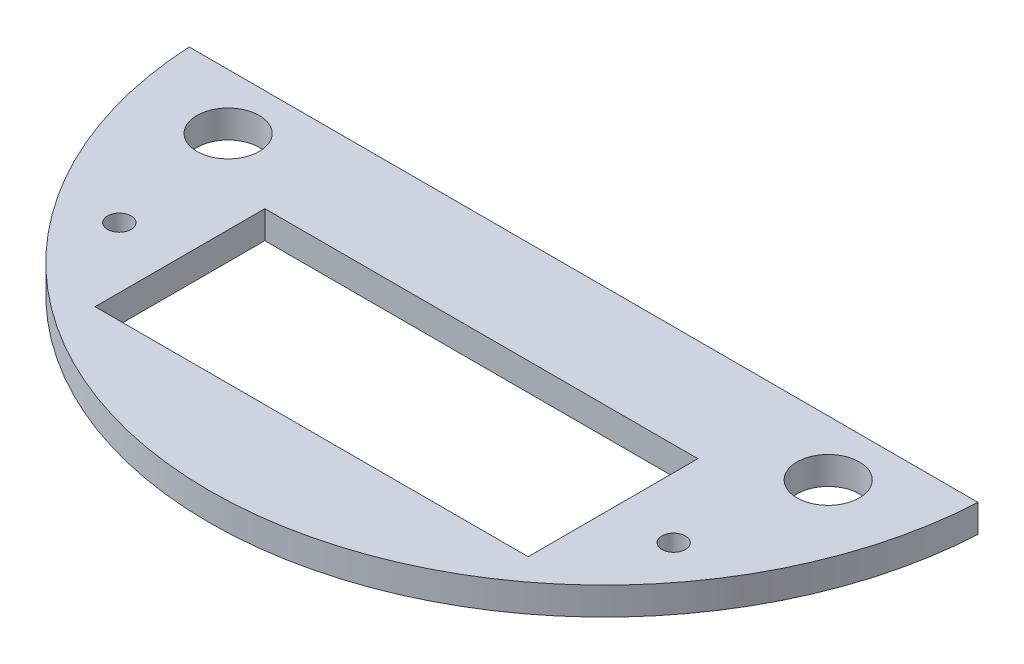
ISO-10303-21;
HEADER;
FILE_DESCRIPTION(('STEP AP214'),'2;1');
FILE_NAME('part.step','',(''),(''),'','','');
FILE_SCHEMA(('AUTOMOTIVE_DESIGN { 1 0 10303 214 1 1 1 1 }'));
ENDSEC;
DATA;
#1=APPLICATION_CONTEXT('core data for automotive mechanical design processes');
#2=APPLICATION_PROTOCOL_DEFINITION('international standard','automotive_design',2000,#1);
#3=PRODUCT_CONTEXT('',#1,'mechanical');
#4=PRODUCT('Part','Part','',(#3));
#5=PRODUCT_RELATED_PRODUCT_CATEGORY('part','',(#4));
#6=PRODUCT_DEFINITION_FORMATION('','',#4);
#7=PRODUCT_DEFINITION_CONTEXT('part definition',#1,'design');
#8=PRODUCT_DEFINITION('design','',#6,#7);
#9=PRODUCT_DEFINITION_SHAPE('','',#8);
#10=(LENGTH_UNIT() NAMED_UNIT(*) SI_UNIT(.MILLI.,.METRE.));
#11=(NAMED_UNIT(*) PLANE_ANGLE_UNIT() SI_UNIT($,.RADIAN.));
#12=(NAMED_UNIT(*) SI_UNIT($,.STERADIAN.) SOLID_ANGLE_UNIT());
#13=UNCERTAINTY_MEASURE_WITH_UNIT(LENGTH_MEASURE(1.E-05),#10,'distance_accuracy_value','');
#14=(GEOMETRIC_REPRESENTATION_CONTEXT(3) GLOBAL_UNCERTAINTY_ASSIGNED_CONTEXT((#13)) GLOBAL_UNIT_ASSIGNED_CONTEXT((#10,
#11,#12)) REPRESENTATION_CONTEXT('',''));
#15=CARTESIAN_POINT('',(0.,0.,0.));
#16=DIRECTION('',(0.,0.,1.));
#17=DIRECTION('',(1.,0.,0.));
#18=AXIS2_PLACEMENT_3D('',#15,#16,#17);
#19=CARTESIAN_POINT('',(0.,4.,0.));
#20=DIRECTION('',(0.,1.,0.));
#21=DIRECTION('',(0.,0.,1.));
#22=AXIS2_PLACEMENT_3D('',#19,#20,#21);
#23=PLANE('',#22);
#24=CARTESIAN_POINT('',(40.,4.,0.));
#25=DIRECTION('',(0.,-1.,0.));
#26=DIRECTION('',(0.,0.,-1.));
#27=AXIS2_PLACEMENT_3D('',#24,#25,#26);
#28=CIRCLE('',#27,1.7);
#29=CARTESIAN_POINT('',(40.,4.,-1.7));
#30=VERTEX_POINT('',#29);
#31=EDGE_CURVE('E146',#30,#30,#28,.T.);
#32=ORIENTED_EDGE('',*,*,#31,.T.);
#33=EDGE_LOOP('',(#32));
#34=FACE_BOUND('',#33,.T.);
#35=CARTESIAN_POINT('',(-40.,4.,0.));
#36=DIRECTION('',(0.,-1.,0.));
#37=DIRECTION('',(0.,0.,-1.));
#38=AXIS2_PLACEMENT_3D('',#35,#36,#37);
#39=CIRCLE('',#38,1.7);
#40=CARTESIAN_POINT('',(-40.,4.,-1.7));
#41=VERTEX_POINT('',#40);
#42=EDGE_CURVE('E93',#41,#41,#39,.T.);
#43=ORIENTED_EDGE('',*,*,#42,.T.);
#44=EDGE_LOOP('',(#43));
#45=FACE_BOUND('',#44,.T.);
#46=CARTESIAN_POINT('',(-43.3,4.,-19.));
#47=DIRECTION('',(0.,1.,0.));
#48=DIRECTION('',(0.,0.,1.));
#49=AXIS2_PLACEMENT_3D('',#46,#47,#48);
#50=CIRCLE('',#49,4.49999999999999);
#51=CARTESIAN_POINT('',(-43.3,4.,-14.5));
#52=VERTEX_POINT('',#51);
#53=EDGE_CURVE('E137',#52,#52,#50,.T.);
#54=ORIENTED_EDGE('',*,*,#53,.F.);
#55=EDGE_LOOP('',(#54));
#56=FACE_BOUND('',#55,.T.);
#57=CARTESIAN_POINT('',(43.3,4.,-19.));
#58=DIRECTION('',(0.,1.,0.));
#59=DIRECTION('',(0.,0.,1.));
#60=AXIS2_PLACEMENT_3D('',#57,#58,#59);
#61=CIRCLE('',#60,4.49999999999999);
#62=CARTESIAN_POINT('',(43.3,4.,-14.5));
#63=VERTEX_POINT('',#62);
#64=EDGE_CURVE('E131',#63,#63,#61,.T.);
#65=ORIENTED_EDGE('',*,*,#64,.F.);
#66=EDGE_LOOP('',(#65));
#67=FACE_BOUND('',#66,.T.);
#68=DIRECTION('',(1.,0.,0.));
#69=VECTOR('',#68,1.);
#70=CARTESIAN_POINT('',(31.25,4.,12.25));
#71=LINE('',#70,#69);
#72=CARTESIAN_POINT('',(-31.25,4.,12.25));
#73=VERTEX_POINT('',#72);
#74=CARTESIAN_POINT('',(31.25,4.,12.25));
#75=VERTEX_POINT('',#74);
#76=EDGE_CURVE('E126',#73,#75,#71,.T.);
#77=ORIENTED_EDGE('',*,*,#76,.F.);
#78=DIRECTION('',(0.,0.,1.));
#79=VECTOR('',#78,1.);
#80=CARTESIAN_POINT('',(-31.25,4.,-12.25));
#81=LINE('',#80,#79);
#82=CARTESIAN_POINT('',(-31.25,4.,-12.25));
#83=VERTEX_POINT('',#82);
#84=EDGE_CURVE('E112',#83,#73,#81,.T.);
#85=ORIENTED_EDGE('',*,*,#84,.F.);
#86=DIRECTION('',(-1.,0.,0.));
#87=VECTOR('',#86,1.);
#88=CARTESIAN_POINT('',(31.25,4.,-12.25));
#89=LINE('',#88,#87);
#90=CARTESIAN_POINT('',(31.25,4.,-12.25));
#91=VERTEX_POINT('',#90);
#92=EDGE_CURVE('E108',#91,#83,#89,.T.);
#93=ORIENTED_EDGE('',*,*,#92,.F.);
#94=DIRECTION('',(0.,0.,-1.));
#95=VECTOR('',#94,1.);
#96=CARTESIAN_POINT('',(31.25,4.,-12.25));
#97=LINE('',#96,#95);
#98=EDGE_CURVE('E124',#75,#91,#97,.T.);
#99=ORIENTED_EDGE('',*,*,#98,.F.);
#100=EDGE_LOOP('',(#77,#85,#93,#99));
#101=FACE_BOUND('',#100,.T.);
#102=DIRECTION('',(-1.,0.,0.));
#103=VECTOR('',#102,1.);
#104=CARTESIAN_POINT('',(-58.9016078409477,4.,-27.));
#105=LINE('',#104,#103);
#106=CARTESIAN_POINT('',(56.9209978830308,4.,-27.));
#107=VERTEX_POINT('',#106);
#108=CARTESIAN_POINT('',(-56.9209978830308,4.,-27.));
#109=VERTEX_POINT('',#108);
#110=EDGE_CURVE('E92',#107,#109,#105,.T.);
#111=ORIENTED_EDGE('',*,*,#110,.T.);
#112=CARTESIAN_POINT('',(0.,4.,-30.));
#113=DIRECTION('',(0.,1.,0.));
#114=DIRECTION('',(0.,0.,1.));
#115=AXIS2_PLACEMENT_3D('',#112,#113,#114);
#116=CIRCLE('',#115,57.);
#117=EDGE_CURVE('E47',#109,#107,#116,.T.);
#118=ORIENTED_EDGE('',*,*,#117,.T.);
#119=EDGE_LOOP('',(#111,#118));
#120=FACE_BOUND('',#119,.T.);
#121=ADVANCED_FACE('F33',(#34,#45,#56,#67,#101,#120),#23,.T.);
#122=CARTESIAN_POINT('',(0.,0.,0.));
#123=DIRECTION('',(0.,1.,0.));
#124=DIRECTION('',(0.,0.,1.));
#125=AXIS2_PLACEMENT_3D('',#122,#123,#124);
#126=PLANE('',#125);
#127=CARTESIAN_POINT('',(40.,0.,0.));
#128=DIRECTION('',(0.,-1.,0.));
#129=DIRECTION('',(0.,0.,-1.));
#130=AXIS2_PLACEMENT_3D('',#127,#128,#129);
#131=CIRCLE('',#130,1.7);
#132=CARTESIAN_POINT('',(40.,0.,-1.7));
#133=VERTEX_POINT('',#132);
#134=EDGE_CURVE('E149',#133,#133,#131,.T.);
#135=ORIENTED_EDGE('',*,*,#134,.F.);
#136=EDGE_LOOP('',(#135));
#137=FACE_BOUND('',#136,.T.);
#138=CARTESIAN_POINT('',(-40.,0.,0.));
#139=DIRECTION('',(0.,-1.,0.));
#140=DIRECTION('',(0.,0.,-1.));
#141=AXIS2_PLACEMENT_3D('',#138,#139,#140);
#142=CIRCLE('',#141,1.7);
#143=CARTESIAN_POINT('',(-40.,0.,-1.7));
#144=VERTEX_POINT('',#143);
#145=EDGE_CURVE('E143',#144,#144,#142,.T.);
#146=ORIENTED_EDGE('',*,*,#145,.F.);
#147=EDGE_LOOP('',(#146));
#148=FACE_BOUND('',#147,.T.);
#149=DIRECTION('',(0.,0.,1.));
#150=VECTOR('',#149,1.);
#151=CARTESIAN_POINT('',(-31.25,0.,-12.25));
#152=LINE('',#151,#150);
#153=CARTESIAN_POINT('',(-31.25,0.,-12.25));
#154=VERTEX_POINT('',#153);
#155=CARTESIAN_POINT('',(-31.25,0.,12.25));
#156=VERTEX_POINT('',#155);
#157=EDGE_CURVE('E119',#154,#156,#152,.T.);
#158=ORIENTED_EDGE('',*,*,#157,.T.);
#159=DIRECTION('',(1.,0.,0.));
#160=VECTOR('',#159,1.);
#161=CARTESIAN_POINT('',(31.25,0.,12.25));
#162=LINE('',#161,#160);
#163=CARTESIAN_POINT('',(31.25,0.,12.25));
#164=VERTEX_POINT('',#163);
#165=EDGE_CURVE('E116',#156,#164,#162,.T.);
#166=ORIENTED_EDGE('',*,*,#165,.T.);
#167=DIRECTION('',(0.,0.,-1.));
#168=VECTOR('',#167,1.);
#169=CARTESIAN_POINT('',(31.25,0.,-12.25));
#170=LINE('',#169,#168);
#171=CARTESIAN_POINT('',(31.25,0.,-12.25));
#172=VERTEX_POINT('',#171);
#173=EDGE_CURVE('E113',#164,#172,#170,.T.);
#174=ORIENTED_EDGE('',*,*,#173,.T.);
#175=DIRECTION('',(-1.,0.,0.));
#176=VECTOR('',#175,1.);
#177=CARTESIAN_POINT('',(31.25,0.,-12.25));
#178=LINE('',#177,#176);
#179=EDGE_CURVE('E109',#172,#154,#178,.T.);
#180=ORIENTED_EDGE('',*,*,#179,.T.);
#181=EDGE_LOOP('',(#158,#166,#174,#180));
#182=FACE_BOUND('',#181,.T.);
#183=CARTESIAN_POINT('',(43.3,0.,-19.));
#184=DIRECTION('',(0.,1.,0.));
#185=DIRECTION('',(0.,0.,1.));
#186=AXIS2_PLACEMENT_3D('',#183,#184,#185);
#187=CIRCLE('',#186,4.5);
#188=CARTESIAN_POINT('',(43.3,0.,-14.5));
#189=VERTEX_POINT('',#188);
#190=EDGE_CURVE('E122',#189,#189,#187,.T.);
#191=ORIENTED_EDGE('',*,*,#190,.T.);
#192=EDGE_LOOP('',(#191));
#193=FACE_BOUND('',#192,.T.);
#194=CARTESIAN_POINT('',(-43.3,0.,-19.));
#195=DIRECTION('',(0.,1.,0.));
#196=DIRECTION('',(0.,0.,1.));
#197=AXIS2_PLACEMENT_3D('',#194,#195,#196);
#198=CIRCLE('',#197,4.5);
#199=CARTESIAN_POINT('',(-43.3,0.,-14.5));
#200=VERTEX_POINT('',#199);
#201=EDGE_CURVE('E134',#200,#200,#198,.T.);
#202=ORIENTED_EDGE('',*,*,#201,.T.);
#203=EDGE_LOOP('',(#202));
#204=FACE_BOUND('',#203,.T.);
#205=CARTESIAN_POINT('',(0.,0.,-30.));
#206=DIRECTION('',(0.,1.,0.));
#207=DIRECTION('',(0.,0.,1.));
#208=AXIS2_PLACEMENT_3D('',#205,#206,#207);
#209=CIRCLE('',#208,57.);
#210=CARTESIAN_POINT('',(-56.9209978830308,0.,-27.));
#211=VERTEX_POINT('',#210);
#212=CARTESIAN_POINT('',(56.9209978830308,0.,-27.));
#213=VERTEX_POINT('',#212);
#214=EDGE_CURVE('E85',#211,#213,#209,.T.);
#215=ORIENTED_EDGE('',*,*,#214,.F.);
#216=DIRECTION('',(-1.,0.,0.));
#217=VECTOR('',#216,1.);
#218=CARTESIAN_POINT('',(-58.9016078409477,0.,-27.));
#219=LINE('',#218,#217);
#220=EDGE_CURVE('E95',#213,#211,#219,.T.);
#221=ORIENTED_EDGE('',*,*,#220,.F.);
#222=EDGE_LOOP('',(#215,#221));
#223=FACE_BOUND('',#222,.T.);
#224=ADVANCED_FACE('F155',(#137,#148,#182,#193,#204,#223),#126,.F.);
#225=CARTESIAN_POINT('',(-58.9016078409477,4.,-27.));
#226=DIRECTION('',(0.,0.,1.));
#227=DIRECTION('',(1.,0.,0.));
#228=AXIS2_PLACEMENT_3D('',#225,#226,#227);
#229=PLANE('',#228);
#230=DIRECTION('',(0.,1.,0.));
#231=VECTOR('',#230,1.);
#232=CARTESIAN_POINT('',(56.9209978830308,0.,-27.));
#233=LINE('',#232,#231);
#234=EDGE_CURVE('E11',#213,#107,#233,.T.);
#235=ORIENTED_EDGE('',*,*,#234,.F.);
#236=ORIENTED_EDGE('',*,*,#220,.T.);
#237=DIRECTION('',(0.,1.,0.));
#238=VECTOR('',#237,1.);
#239=CARTESIAN_POINT('',(-56.9209978830308,0.,-27.));
#240=LINE('',#239,#238);
#241=EDGE_CURVE('E41',#109,#211,#240,.F.);
#242=ORIENTED_EDGE('',*,*,#241,.F.);
#243=ORIENTED_EDGE('',*,*,#110,.F.);
#244=EDGE_LOOP('',(#235,#236,#242,#243));
#245=FACE_BOUND('',#244,.T.);
#246=ADVANCED_FACE('F35',(#245),#229,.F.);
#247=CARTESIAN_POINT('',(-31.25,4.,-12.25));
#248=DIRECTION('',(1.,0.,0.));
#249=DIRECTION('',(0.,0.,-1.));
#250=AXIS2_PLACEMENT_3D('',#247,#248,#249);
#251=PLANE('',#250);
#252=ORIENTED_EDGE('',*,*,#157,.F.);
#253=DIRECTION('',(0.,-1.,0.));
#254=VECTOR('',#253,1.);
#255=CARTESIAN_POINT('',(-31.25,4.,-12.25));
#256=LINE('',#255,#254);
#257=EDGE_CURVE('E105',#83,#154,#256,.T.);
#258=ORIENTED_EDGE('',*,*,#257,.F.);
#259=ORIENTED_EDGE('',*,*,#84,.T.);
#260=DIRECTION('',(0.,-1.,0.));
#261=VECTOR('',#260,1.);
#262=CARTESIAN_POINT('',(-31.25,4.,12.25));
#263=LINE('',#262,#261);
#264=EDGE_CURVE('E97',#73,#156,#263,.T.);
#265=ORIENTED_EDGE('',*,*,#264,.T.);
#266=EDGE_LOOP('',(#252,#258,#259,#265));
#267=FACE_BOUND('',#266,.T.);
#268=ADVANCED_FACE('F191',(#267),#251,.T.);
#269=CARTESIAN_POINT('',(31.25,4.,12.25));
#270=DIRECTION('',(0.,0.,-1.));
#271=DIRECTION('',(-1.,0.,0.));
#272=AXIS2_PLACEMENT_3D('',#269,#270,#271);
#273=PLANE('',#272);
#274=ORIENTED_EDGE('',*,*,#165,.F.);
#275=ORIENTED_EDGE('',*,*,#264,.F.);
#276=ORIENTED_EDGE('',*,*,#76,.T.);
#277=DIRECTION('',(0.,-1.,0.));
#278=VECTOR('',#277,1.);
#279=CARTESIAN_POINT('',(31.25,4.,12.25));
#280=LINE('',#279,#278);
#281=EDGE_CURVE('E102',#75,#164,#280,.T.);
#282=ORIENTED_EDGE('',*,*,#281,.T.);
#283=EDGE_LOOP('',(#274,#275,#276,#282));
#284=FACE_BOUND('',#283,.T.);
#285=ADVANCED_FACE('F186',(#284),#273,.T.);
#286=CARTESIAN_POINT('',(31.25,4.,-12.25));
#287=DIRECTION('',(-1.,0.,0.));
#288=DIRECTION('',(0.,0.,1.));
#289=AXIS2_PLACEMENT_3D('',#286,#287,#288);
#290=PLANE('',#289);
#291=ORIENTED_EDGE('',*,*,#173,.F.);
#292=ORIENTED_EDGE('',*,*,#281,.F.);
#293=ORIENTED_EDGE('',*,*,#98,.T.);
#294=DIRECTION('',(0.,-1.,0.));
#295=VECTOR('',#294,1.);
#296=CARTESIAN_POINT('',(31.25,4.,-12.25));
#297=LINE('',#296,#295);
#298=EDGE_CURVE('E55',#91,#172,#297,.T.);
#299=ORIENTED_EDGE('',*,*,#298,.T.);
#300=EDGE_LOOP('',(#291,#292,#293,#299));
#301=FACE_BOUND('',#300,.T.);
#302=ADVANCED_FACE('F189',(#301),#290,.T.);
#303=CARTESIAN_POINT('',(31.25,4.,-12.25));
#304=DIRECTION('',(0.,0.,1.));
#305=DIRECTION('',(1.,0.,0.));
#306=AXIS2_PLACEMENT_3D('',#303,#304,#305);
#307=PLANE('',#306);
#308=ORIENTED_EDGE('',*,*,#179,.F.);
#309=ORIENTED_EDGE('',*,*,#298,.F.);
#310=ORIENTED_EDGE('',*,*,#92,.T.);
#311=ORIENTED_EDGE('',*,*,#257,.T.);
#312=EDGE_LOOP('',(#308,#309,#310,#311));
#313=FACE_BOUND('',#312,.T.);
#314=ADVANCED_FACE('F193',(#313),#307,.T.);
#315=CARTESIAN_POINT('',(43.3,4.,-19.));
#316=DIRECTION('',(0.,1.,0.));
#317=DIRECTION('',(0.,0.,1.));
#318=AXIS2_PLACEMENT_3D('',#315,#316,#317);
#319=CYLINDRICAL_SURFACE('',#318,4.49999999999999);
#320=ORIENTED_EDGE('',*,*,#190,.F.);
#321=EDGE_LOOP('',(#320));
#322=FACE_BOUND('',#321,.T.);
#323=ORIENTED_EDGE('',*,*,#64,.T.);
#324=EDGE_LOOP('',(#323));
#325=FACE_BOUND('',#324,.T.);
#326=ADVANCED_FACE('F169',(#322,#325),#319,.F.);
#327=CARTESIAN_POINT('',(-43.3,4.,-19.));
#328=DIRECTION('',(0.,1.,0.));
#329=DIRECTION('',(0.,0.,1.));
#330=AXIS2_PLACEMENT_3D('',#327,#328,#329);
#331=CYLINDRICAL_SURFACE('',#330,4.49999999999999);
#332=ORIENTED_EDGE('',*,*,#201,.F.);
#333=EDGE_LOOP('',(#332));
#334=FACE_BOUND('',#333,.T.);
#335=ORIENTED_EDGE('',*,*,#53,.T.);
#336=EDGE_LOOP('',(#335));
#337=FACE_BOUND('',#336,.T.);
#338=ADVANCED_FACE('F166',(#334,#337),#331,.F.);
#339=CARTESIAN_POINT('',(0.,0.,-30.));
#340=DIRECTION('',(0.,1.,0.));
#341=DIRECTION('',(0.,0.,1.));
#342=AXIS2_PLACEMENT_3D('',#339,#340,#341);
#343=CYLINDRICAL_SURFACE('',#342,57.);
#344=ORIENTED_EDGE('',*,*,#234,.T.);
#345=ORIENTED_EDGE('',*,*,#117,.F.);
#346=ORIENTED_EDGE('',*,*,#241,.T.);
#347=ORIENTED_EDGE('',*,*,#214,.T.);
#348=EDGE_LOOP('',(#344,#345,#346,#347));
#349=FACE_BOUND('',#348,.T.);
#350=ADVANCED_FACE('F83',(#349),#343,.T.);
#351=CARTESIAN_POINT('',(-40.,0.,0.));
#352=DIRECTION('',(0.,-1.,0.));
#353=DIRECTION('',(0.,0.,-1.));
#354=AXIS2_PLACEMENT_3D('',#351,#352,#353);
#355=CYLINDRICAL_SURFACE('',#354,1.7);
#356=ORIENTED_EDGE('',*,*,#42,.F.);
#357=EDGE_LOOP('',(#356));
#358=FACE_BOUND('',#357,.T.);
#359=ORIENTED_EDGE('',*,*,#145,.T.);
#360=EDGE_LOOP('',(#359));
#361=FACE_BOUND('',#360,.T.);
#362=ADVANCED_FACE('F230',(#358,#361),#355,.F.);
#363=CARTESIAN_POINT('',(40.,0.,0.));
#364=DIRECTION('',(0.,-1.,0.));
#365=DIRECTION('',(0.,0.,-1.));
#366=AXIS2_PLACEMENT_3D('',#363,#364,#365);
#367=CYLINDRICAL_SURFACE('',#366,1.7);
#368=ORIENTED_EDGE('',*,*,#31,.F.);
#369=EDGE_LOOP('',(#368));
#370=FACE_BOUND('',#369,.T.);
#371=ORIENTED_EDGE('',*,*,#134,.T.);
#372=EDGE_LOOP('',(#371));
#373=FACE_BOUND('',#372,.T.);
#374=ADVANCED_FACE('F153',(#370,#373),#367,.F.);
#375=CLOSED_SHELL('',(#121,#224,#246,#268,#285,#302,#314,#326,#338,#350,#362,#374));
#376=MANIFOLD_SOLID_BREP('B2',#375);
#377=ADVANCED_BREP_SHAPE_REPRESENTATION('',(#18,#376),#14);
#378=SHAPE_DEFINITION_REPRESENTATION(#9,#377);
ENDSEC;
END-ISO-10303-21;
